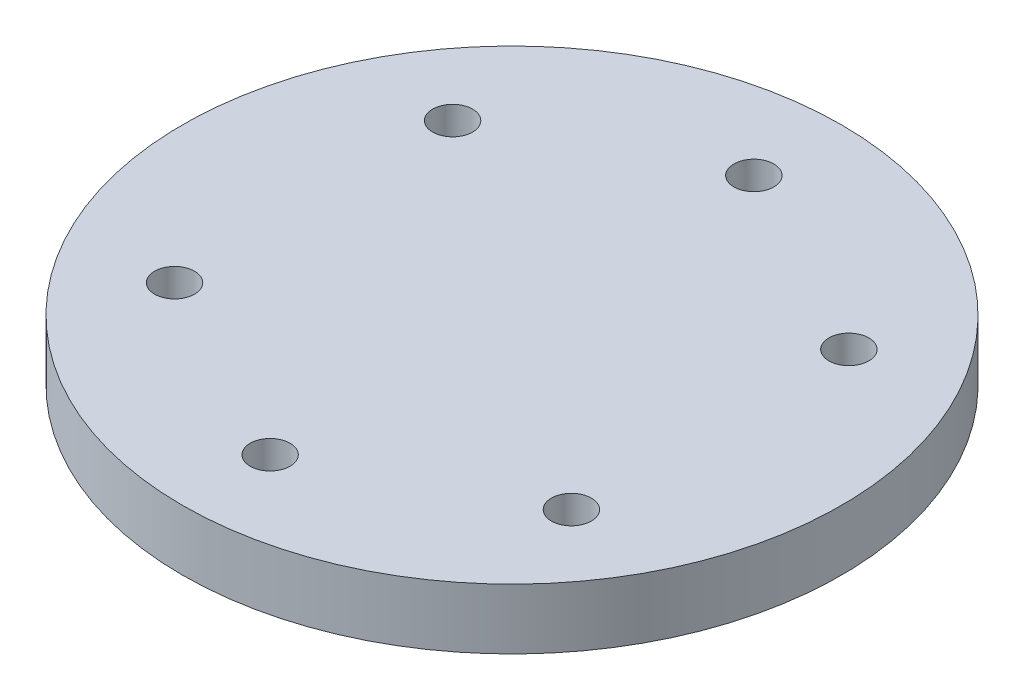
ISO-10303-21;
HEADER;
FILE_DESCRIPTION(('STEP AP214'),'2;1');
FILE_NAME('part.step','',(''),(''),'','','');
FILE_SCHEMA(('AUTOMOTIVE_DESIGN { 1 0 10303 214 1 1 1 1 }'));
ENDSEC;
DATA;
#1=APPLICATION_CONTEXT('core data for automotive mechanical design processes');
#2=APPLICATION_PROTOCOL_DEFINITION('international standard','automotive_design',2000,#1);
#3=PRODUCT_CONTEXT('',#1,'mechanical');
#4=PRODUCT('Part','Part','',(#3));
#5=PRODUCT_RELATED_PRODUCT_CATEGORY('part','',(#4));
#6=PRODUCT_DEFINITION_FORMATION('','',#4);
#7=PRODUCT_DEFINITION_CONTEXT('part definition',#1,'design');
#8=PRODUCT_DEFINITION('design','',#6,#7);
#9=PRODUCT_DEFINITION_SHAPE('','',#8);
#10=(LENGTH_UNIT() NAMED_UNIT(*) SI_UNIT(.MILLI.,.METRE.));
#11=(NAMED_UNIT(*) PLANE_ANGLE_UNIT() SI_UNIT($,.RADIAN.));
#12=(NAMED_UNIT(*) SI_UNIT($,.STERADIAN.) SOLID_ANGLE_UNIT());
#13=UNCERTAINTY_MEASURE_WITH_UNIT(LENGTH_MEASURE(1.E-05),#10,'distance_accuracy_value','');
#14=(GEOMETRIC_REPRESENTATION_CONTEXT(3) GLOBAL_UNCERTAINTY_ASSIGNED_CONTEXT((#13)) GLOBAL_UNIT_ASSIGNED_CONTEXT((#10,
#11,#12)) REPRESENTATION_CONTEXT('',''));
#15=CARTESIAN_POINT('',(0.,0.,0.));
#16=DIRECTION('',(0.,0.,1.));
#17=DIRECTION('',(1.,0.,0.));
#18=AXIS2_PLACEMENT_3D('',#15,#16,#17);
#19=CARTESIAN_POINT('',(0.,5.,0.));
#20=DIRECTION('',(0.,-1.,0.));
#21=DIRECTION('',(0.,0.,-1.));
#22=AXIS2_PLACEMENT_3D('',#19,#20,#21);
#23=CYLINDRICAL_SURFACE('',#22,27.25);
#24=CARTESIAN_POINT('',(0.,5.,0.));
#25=DIRECTION('',(0.,1.,0.));
#26=DIRECTION('',(0.,0.,1.));
#27=AXIS2_PLACEMENT_3D('',#24,#25,#26);
#28=CIRCLE('',#27,27.25);
#29=CARTESIAN_POINT('',(0.,5.,27.25));
#30=VERTEX_POINT('',#29);
#31=EDGE_CURVE('E10',#30,#30,#28,.T.);
#32=ORIENTED_EDGE('',*,*,#31,.F.);
#33=EDGE_LOOP('',(#32));
#34=FACE_BOUND('',#33,.T.);
#35=CARTESIAN_POINT('',(0.,0.,0.));
#36=DIRECTION('',(0.,1.,0.));
#37=DIRECTION('',(0.,0.,1.));
#38=AXIS2_PLACEMENT_3D('',#35,#36,#37);
#39=CIRCLE('',#38,27.25);
#40=CARTESIAN_POINT('',(0.,0.,27.25));
#41=VERTEX_POINT('',#40);
#42=EDGE_CURVE('E37',#41,#41,#39,.T.);
#43=ORIENTED_EDGE('',*,*,#42,.T.);
#44=EDGE_LOOP('',(#43));
#45=FACE_BOUND('',#44,.T.);
#46=ADVANCED_FACE('F30',(#34,#45),#23,.T.);
#47=CARTESIAN_POINT('',(0.,5.,0.));
#48=DIRECTION('',(0.,1.,0.));
#49=DIRECTION('',(0.,0.,1.));
#50=AXIS2_PLACEMENT_3D('',#47,#48,#49);
#51=PLANE('',#50);
#52=CARTESIAN_POINT('',(0.,5.,-20.));
#53=DIRECTION('',(0.,1.,0.));
#54=DIRECTION('',(0.,0.,1.));
#55=AXIS2_PLACEMENT_3D('',#52,#53,#54);
#56=CIRCLE('',#55,1.65);
#57=CARTESIAN_POINT('',(0.,5.,-18.35));
#58=VERTEX_POINT('',#57);
#59=EDGE_CURVE('E51',#58,#58,#56,.T.);
#60=ORIENTED_EDGE('',*,*,#59,.F.);
#61=EDGE_LOOP('',(#60));
#62=FACE_BOUND('',#61,.T.);
#63=CARTESIAN_POINT('',(-16.2709355203389,5.,11.6299895654714));
#64=DIRECTION('',(0.,1.,0.));
#65=DIRECTION('',(0.,0.,1.));
#66=AXIS2_PLACEMENT_3D('',#63,#64,#65);
#67=CIRCLE('',#66,1.65);
#68=CARTESIAN_POINT('',(-16.2709355203389,5.,13.2799895654714));
#69=VERTEX_POINT('',#68);
#70=EDGE_CURVE('E128',#69,#69,#67,.T.);
#71=ORIENTED_EDGE('',*,*,#70,.F.);
#72=EDGE_LOOP('',(#71));
#73=FACE_BOUND('',#72,.T.);
#74=CARTESIAN_POINT('',(0.,5.,20.));
#75=DIRECTION('',(0.,1.,0.));
#76=DIRECTION('',(0.,0.,1.));
#77=AXIS2_PLACEMENT_3D('',#74,#75,#76);
#78=CIRCLE('',#77,1.65);
#79=CARTESIAN_POINT('',(0.,5.,21.65));
#80=VERTEX_POINT('',#79);
#81=EDGE_CURVE('E44',#80,#80,#78,.T.);
#82=ORIENTED_EDGE('',*,*,#81,.F.);
#83=EDGE_LOOP('',(#82));
#84=FACE_BOUND('',#83,.T.);
#85=CARTESIAN_POINT('',(16.3830408857798,5.,11.4715287270209));
#86=DIRECTION('',(0.,1.,0.));
#87=DIRECTION('',(0.,0.,1.));
#88=AXIS2_PLACEMENT_3D('',#85,#86,#87);
#89=CIRCLE('',#88,1.65);
#90=CARTESIAN_POINT('',(16.3830408857798,5.,13.1215287270209));
#91=VERTEX_POINT('',#90);
#92=EDGE_CURVE('E122',#91,#91,#89,.T.);
#93=ORIENTED_EDGE('',*,*,#92,.F.);
#94=EDGE_LOOP('',(#93));
#95=FACE_BOUND('',#94,.T.);
#96=CARTESIAN_POINT('',(16.3830408857798,5.,-11.4715287270209));
#97=DIRECTION('',(0.,1.,0.));
#98=DIRECTION('',(0.,0.,1.));
#99=AXIS2_PLACEMENT_3D('',#96,#97,#98);
#100=CIRCLE('',#99,1.65);
#101=CARTESIAN_POINT('',(16.3830408857798,5.,-9.82152872702094));
#102=VERTEX_POINT('',#101);
#103=EDGE_CURVE('E114',#102,#102,#100,.T.);
#104=ORIENTED_EDGE('',*,*,#103,.F.);
#105=EDGE_LOOP('',(#104));
#106=FACE_BOUND('',#105,.T.);
#107=CARTESIAN_POINT('',(-16.3830408857798,5.,-11.4715287270209));
#108=DIRECTION('',(0.,1.,0.));
#109=DIRECTION('',(0.,0.,1.));
#110=AXIS2_PLACEMENT_3D('',#107,#108,#109);
#111=CIRCLE('',#110,1.65);
#112=CARTESIAN_POINT('',(-16.3830408857798,5.,-9.82152872702094));
#113=VERTEX_POINT('',#112);
#114=EDGE_CURVE('E121',#113,#113,#111,.T.);
#115=ORIENTED_EDGE('',*,*,#114,.F.);
#116=EDGE_LOOP('',(#115));
#117=FACE_BOUND('',#116,.T.);
#118=ORIENTED_EDGE('',*,*,#31,.T.);
#119=EDGE_LOOP('',(#118));
#120=FACE_BOUND('',#119,.T.);
#121=ADVANCED_FACE('F81',(#62,#73,#84,#95,#106,#117,#120),#51,.T.);
#122=CARTESIAN_POINT('',(0.,0.,0.));
#123=DIRECTION('',(0.,1.,0.));
#124=DIRECTION('',(0.,0.,1.));
#125=AXIS2_PLACEMENT_3D('',#122,#123,#124);
#126=PLANE('',#125);
#127=CARTESIAN_POINT('',(0.,0.,-20.));
#128=DIRECTION('',(0.,1.,0.));
#129=DIRECTION('',(0.,0.,1.));
#130=AXIS2_PLACEMENT_3D('',#127,#128,#129);
#131=CIRCLE('',#130,1.65);
#132=CARTESIAN_POINT('',(0.,0.,-18.35));
#133=VERTEX_POINT('',#132);
#134=EDGE_CURVE('E33',#133,#133,#131,.T.);
#135=ORIENTED_EDGE('',*,*,#134,.T.);
#136=EDGE_LOOP('',(#135));
#137=FACE_BOUND('',#136,.T.);
#138=CARTESIAN_POINT('',(-16.2709355203389,0.,11.6299895654714));
#139=DIRECTION('',(0.,1.,0.));
#140=DIRECTION('',(0.,0.,1.));
#141=AXIS2_PLACEMENT_3D('',#138,#139,#140);
#142=CIRCLE('',#141,1.65);
#143=CARTESIAN_POINT('',(-16.2709355203389,0.,13.2799895654714));
#144=VERTEX_POINT('',#143);
#145=EDGE_CURVE('E59',#144,#144,#142,.T.);
#146=ORIENTED_EDGE('',*,*,#145,.T.);
#147=EDGE_LOOP('',(#146));
#148=FACE_BOUND('',#147,.T.);
#149=CARTESIAN_POINT('',(0.,0.,20.));
#150=DIRECTION('',(0.,1.,0.));
#151=DIRECTION('',(0.,0.,1.));
#152=AXIS2_PLACEMENT_3D('',#149,#150,#151);
#153=CIRCLE('',#152,1.65);
#154=CARTESIAN_POINT('',(0.,0.,21.65));
#155=VERTEX_POINT('',#154);
#156=EDGE_CURVE('E57',#155,#155,#153,.T.);
#157=ORIENTED_EDGE('',*,*,#156,.T.);
#158=EDGE_LOOP('',(#157));
#159=FACE_BOUND('',#158,.T.);
#160=CARTESIAN_POINT('',(16.3830408857798,0.,11.4715287270209));
#161=DIRECTION('',(0.,1.,0.));
#162=DIRECTION('',(0.,0.,1.));
#163=AXIS2_PLACEMENT_3D('',#160,#161,#162);
#164=CIRCLE('',#163,1.65);
#165=CARTESIAN_POINT('',(16.3830408857798,0.,13.1215287270209));
#166=VERTEX_POINT('',#165);
#167=EDGE_CURVE('E54',#166,#166,#164,.T.);
#168=ORIENTED_EDGE('',*,*,#167,.T.);
#169=EDGE_LOOP('',(#168));
#170=FACE_BOUND('',#169,.T.);
#171=CARTESIAN_POINT('',(16.3830408857798,0.,-11.4715287270209));
#172=DIRECTION('',(0.,1.,0.));
#173=DIRECTION('',(0.,0.,1.));
#174=AXIS2_PLACEMENT_3D('',#171,#172,#173);
#175=CIRCLE('',#174,1.65);
#176=CARTESIAN_POINT('',(16.3830408857798,0.,-9.82152872702094));
#177=VERTEX_POINT('',#176);
#178=EDGE_CURVE('E50',#177,#177,#175,.T.);
#179=ORIENTED_EDGE('',*,*,#178,.T.);
#180=EDGE_LOOP('',(#179));
#181=FACE_BOUND('',#180,.T.);
#182=CARTESIAN_POINT('',(-16.3830408857798,0.,-11.4715287270209));
#183=DIRECTION('',(0.,1.,0.));
#184=DIRECTION('',(0.,0.,1.));
#185=AXIS2_PLACEMENT_3D('',#182,#183,#184);
#186=CIRCLE('',#185,1.65);
#187=CARTESIAN_POINT('',(-16.3830408857798,0.,-9.82152872702094));
#188=VERTEX_POINT('',#187);
#189=EDGE_CURVE('E47',#188,#188,#186,.T.);
#190=ORIENTED_EDGE('',*,*,#189,.T.);
#191=EDGE_LOOP('',(#190));
#192=FACE_BOUND('',#191,.T.);
#193=ORIENTED_EDGE('',*,*,#42,.F.);
#194=EDGE_LOOP('',(#193));
#195=FACE_BOUND('',#194,.T.);
#196=ADVANCED_FACE('F66',(#137,#148,#159,#170,#181,#192,#195),#126,.F.);
#197=CARTESIAN_POINT('',(-16.3830408857798,-5.,-11.4715287270209));
#198=DIRECTION('',(0.,1.,0.));
#199=DIRECTION('',(0.,0.,1.));
#200=AXIS2_PLACEMENT_3D('',#197,#198,#199);
#201=CYLINDRICAL_SURFACE('',#200,1.65);
#202=ORIENTED_EDGE('',*,*,#114,.T.);
#203=EDGE_LOOP('',(#202));
#204=FACE_BOUND('',#203,.T.);
#205=ORIENTED_EDGE('',*,*,#189,.F.);
#206=EDGE_LOOP('',(#205));
#207=FACE_BOUND('',#206,.T.);
#208=ADVANCED_FACE('F92',(#204,#207),#201,.F.);
#209=CARTESIAN_POINT('',(16.3830408857798,-5.,-11.4715287270209));
#210=DIRECTION('',(0.,1.,0.));
#211=DIRECTION('',(0.,0.,1.));
#212=AXIS2_PLACEMENT_3D('',#209,#210,#211);
#213=CYLINDRICAL_SURFACE('',#212,1.65);
#214=ORIENTED_EDGE('',*,*,#103,.T.);
#215=EDGE_LOOP('',(#214));
#216=FACE_BOUND('',#215,.T.);
#217=ORIENTED_EDGE('',*,*,#178,.F.);
#218=EDGE_LOOP('',(#217));
#219=FACE_BOUND('',#218,.T.);
#220=ADVANCED_FACE('F96',(#216,#219),#213,.F.);
#221=CARTESIAN_POINT('',(16.3830408857798,-5.,11.4715287270209));
#222=DIRECTION('',(0.,1.,0.));
#223=DIRECTION('',(0.,0.,1.));
#224=AXIS2_PLACEMENT_3D('',#221,#222,#223);
#225=CYLINDRICAL_SURFACE('',#224,1.65);
#226=ORIENTED_EDGE('',*,*,#92,.T.);
#227=EDGE_LOOP('',(#226));
#228=FACE_BOUND('',#227,.T.);
#229=ORIENTED_EDGE('',*,*,#167,.F.);
#230=EDGE_LOOP('',(#229));
#231=FACE_BOUND('',#230,.T.);
#232=ADVANCED_FACE('F102',(#228,#231),#225,.F.);
#233=CARTESIAN_POINT('',(0.,-5.,20.));
#234=DIRECTION('',(0.,1.,0.));
#235=DIRECTION('',(0.,0.,1.));
#236=AXIS2_PLACEMENT_3D('',#233,#234,#235);
#237=CYLINDRICAL_SURFACE('',#236,1.65);
#238=ORIENTED_EDGE('',*,*,#81,.T.);
#239=EDGE_LOOP('',(#238));
#240=FACE_BOUND('',#239,.T.);
#241=ORIENTED_EDGE('',*,*,#156,.F.);
#242=EDGE_LOOP('',(#241));
#243=FACE_BOUND('',#242,.T.);
#244=ADVANCED_FACE('F76',(#240,#243),#237,.F.);
#245=CARTESIAN_POINT('',(-16.2709355203389,-5.,11.6299895654714));
#246=DIRECTION('',(0.,1.,0.));
#247=DIRECTION('',(0.,0.,1.));
#248=AXIS2_PLACEMENT_3D('',#245,#246,#247);
#249=CYLINDRICAL_SURFACE('',#248,1.65);
#250=ORIENTED_EDGE('',*,*,#70,.T.);
#251=EDGE_LOOP('',(#250));
#252=FACE_BOUND('',#251,.T.);
#253=ORIENTED_EDGE('',*,*,#145,.F.);
#254=EDGE_LOOP('',(#253));
#255=FACE_BOUND('',#254,.T.);
#256=ADVANCED_FACE('F70',(#252,#255),#249,.F.);
#257=CARTESIAN_POINT('',(0.,-5.,-20.));
#258=DIRECTION('',(0.,1.,0.));
#259=DIRECTION('',(0.,0.,1.));
#260=AXIS2_PLACEMENT_3D('',#257,#258,#259);
#261=CYLINDRICAL_SURFACE('',#260,1.65);
#262=ORIENTED_EDGE('',*,*,#59,.T.);
#263=EDGE_LOOP('',(#262));
#264=FACE_BOUND('',#263,.T.);
#265=ORIENTED_EDGE('',*,*,#134,.F.);
#266=EDGE_LOOP('',(#265));
#267=FACE_BOUND('',#266,.T.);
#268=ADVANCED_FACE('F68',(#264,#267),#261,.F.);
#269=CLOSED_SHELL('',(#46,#121,#196,#208,#220,#232,#244,#256,#268));
#270=MANIFOLD_SOLID_BREP('B2',#269);
#271=ADVANCED_BREP_SHAPE_REPRESENTATION('',(#18,#270),#14);
#272=SHAPE_DEFINITION_REPRESENTATION(#9,#271);
ENDSEC;
END-ISO-10303-21;
